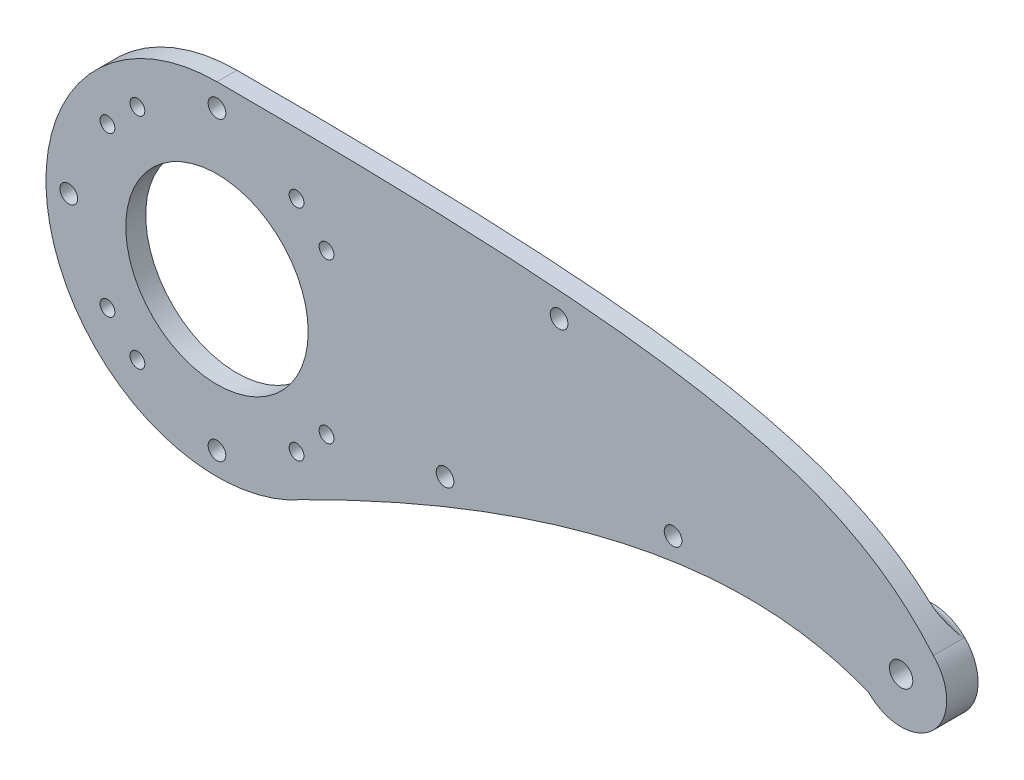
ISO-10303-21;
HEADER;
FILE_DESCRIPTION(('STEP AP214'),'2;1');
FILE_NAME('part.step','',(''),(''),'','','');
FILE_SCHEMA(('AUTOMOTIVE_DESIGN { 1 0 10303 214 1 1 1 1 }'));
ENDSEC;
DATA;
#1=APPLICATION_CONTEXT('core data for automotive mechanical design processes');
#2=APPLICATION_PROTOCOL_DEFINITION('international standard','automotive_design',2000,#1);
#3=PRODUCT_CONTEXT('',#1,'mechanical');
#4=PRODUCT('Part','Part','',(#3));
#5=PRODUCT_RELATED_PRODUCT_CATEGORY('part','',(#4));
#6=PRODUCT_DEFINITION_FORMATION('','',#4);
#7=PRODUCT_DEFINITION_CONTEXT('part definition',#1,'design');
#8=PRODUCT_DEFINITION('design','',#6,#7);
#9=PRODUCT_DEFINITION_SHAPE('','',#8);
#10=(LENGTH_UNIT() NAMED_UNIT(*) SI_UNIT(.MILLI.,.METRE.));
#11=(NAMED_UNIT(*) PLANE_ANGLE_UNIT() SI_UNIT($,.RADIAN.));
#12=(NAMED_UNIT(*) SI_UNIT($,.STERADIAN.) SOLID_ANGLE_UNIT());
#13=UNCERTAINTY_MEASURE_WITH_UNIT(LENGTH_MEASURE(1.E-05),#10,'distance_accuracy_value','');
#14=(GEOMETRIC_REPRESENTATION_CONTEXT(3) GLOBAL_UNCERTAINTY_ASSIGNED_CONTEXT((#13)) GLOBAL_UNIT_ASSIGNED_CONTEXT((#10,
#11,#12)) REPRESENTATION_CONTEXT('',''));
#15=CARTESIAN_POINT('',(0.,0.,0.));
#16=DIRECTION('',(0.,0.,1.));
#17=DIRECTION('',(1.,0.,0.));
#18=AXIS2_PLACEMENT_3D('',#15,#16,#17);
#19=CARTESIAN_POINT('',(86.7847382513976,24.9953267195614,0.));
#20=DIRECTION('',(0.,0.,1.));
#21=DIRECTION('',(1.,0.,0.));
#22=AXIS2_PLACEMENT_3D('',#19,#20,#21);
#23=PLANE('',#22);
#24=CARTESIAN_POINT('',(120.,0.,0.));
#25=DIRECTION('',(0.,0.,1.));
#26=DIRECTION('',(1.,0.,0.));
#27=AXIS2_PLACEMENT_3D('',#24,#25,#26);
#28=CIRCLE('',#27,2.04999999999999);
#29=CARTESIAN_POINT('',(122.05,0.,0.));
#30=VERTEX_POINT('',#29);
#31=EDGE_CURVE('E332',#30,#30,#28,.T.);
#32=ORIENTED_EDGE('',*,*,#31,.T.);
#33=EDGE_LOOP('',(#32));
#34=FACE_BOUND('',#33,.T.);
#35=CARTESIAN_POINT('',(120.,0.,0.));
#36=DIRECTION('',(0.,0.,-1.));
#37=DIRECTION('',(-1.,0.,0.));
#38=AXIS2_PLACEMENT_3D('',#35,#36,#37);
#39=CIRCLE('',#38,7.05);
#40=CARTESIAN_POINT('',(112.95,0.,0.));
#41=VERTEX_POINT('',#40);
#42=EDGE_CURVE('E335',#41,#41,#39,.T.);
#43=ORIENTED_EDGE('',*,*,#42,.T.);
#44=EDGE_LOOP('',(#43));
#45=FACE_BOUND('',#44,.T.);
#46=ADVANCED_FACE('F48',(#34,#45),#23,.F.);
#47=CARTESIAN_POINT('',(86.7847382513976,24.9953267195614,3.5));
#48=DIRECTION('',(0.,0.,1.));
#49=DIRECTION('',(1.,0.,0.));
#50=AXIS2_PLACEMENT_3D('',#47,#48,#49);
#51=PLANE('',#50);
#52=CARTESIAN_POINT('',(80.,1.,3.5));
#53=DIRECTION('',(0.,0.,1.));
#54=DIRECTION('',(1.,0.,0.));
#55=AXIS2_PLACEMENT_3D('',#52,#53,#54);
#56=CIRCLE('',#55,1.54999999999999);
#57=CARTESIAN_POINT('',(81.55,1.,3.5));
#58=VERTEX_POINT('',#57);
#59=EDGE_CURVE('E356',#58,#58,#56,.T.);
#60=ORIENTED_EDGE('',*,*,#59,.F.);
#61=EDGE_LOOP('',(#60));
#62=FACE_BOUND('',#61,.T.);
#63=CARTESIAN_POINT('',(0.,26.,3.5));
#64=DIRECTION('',(0.,0.,1.));
#65=DIRECTION('',(1.,0.,0.));
#66=AXIS2_PLACEMENT_3D('',#63,#64,#65);
#67=CIRCLE('',#66,1.55);
#68=CARTESIAN_POINT('',(1.55,26.,3.5));
#69=VERTEX_POINT('',#68);
#70=EDGE_CURVE('E372',#69,#69,#67,.T.);
#71=ORIENTED_EDGE('',*,*,#70,.F.);
#72=EDGE_LOOP('',(#71));
#73=FACE_BOUND('',#72,.T.);
#74=CARTESIAN_POINT('',(-19.2141536164048,13.9598997419465,3.5));
#75=DIRECTION('',(0.,0.,1.));
#76=DIRECTION('',(1.,0.,0.));
#77=AXIS2_PLACEMENT_3D('',#74,#75,#76);
#78=CIRCLE('',#77,1.3);
#79=CARTESIAN_POINT('',(-17.9141536164048,13.9598997419465,3.5));
#80=VERTEX_POINT('',#79);
#81=EDGE_CURVE('E384',#80,#80,#78,.T.);
#82=ORIENTED_EDGE('',*,*,#81,.F.);
#83=EDGE_LOOP('',(#82));
#84=FACE_BOUND('',#83,.T.);
#85=CARTESIAN_POINT('',(-13.9598997419464,-19.2141536164049,3.5));
#86=DIRECTION('',(0.,0.,1.));
#87=DIRECTION('',(1.,0.,0.));
#88=AXIS2_PLACEMENT_3D('',#85,#86,#87);
#89=CIRCLE('',#88,1.3);
#90=CARTESIAN_POINT('',(-12.6598997419464,-19.2141536164049,3.5));
#91=VERTEX_POINT('',#90);
#92=EDGE_CURVE('E395',#91,#91,#89,.T.);
#93=ORIENTED_EDGE('',*,*,#92,.F.);
#94=EDGE_LOOP('',(#93));
#95=FACE_BOUND('',#94,.T.);
#96=CARTESIAN_POINT('',(19.2141536164049,-13.9598997419463,3.5));
#97=DIRECTION('',(0.,0.,1.));
#98=DIRECTION('',(1.,0.,0.));
#99=AXIS2_PLACEMENT_3D('',#96,#97,#98);
#100=CIRCLE('',#99,1.3);
#101=CARTESIAN_POINT('',(20.5141536164049,-13.9598997419463,3.5));
#102=VERTEX_POINT('',#101);
#103=EDGE_CURVE('E403',#102,#102,#100,.T.);
#104=ORIENTED_EDGE('',*,*,#103,.F.);
#105=EDGE_LOOP('',(#104));
#106=FACE_BOUND('',#105,.T.);
#107=CARTESIAN_POINT('',(-26.,0.,3.5));
#108=DIRECTION('',(0.,0.,1.));
#109=DIRECTION('',(1.,0.,0.));
#110=AXIS2_PLACEMENT_3D('',#107,#108,#109);
#111=CIRCLE('',#110,1.55);
#112=CARTESIAN_POINT('',(-24.45,0.,3.5));
#113=VERTEX_POINT('',#112);
#114=EDGE_CURVE('E412',#113,#113,#111,.T.);
#115=ORIENTED_EDGE('',*,*,#114,.F.);
#116=EDGE_LOOP('',(#115));
#117=FACE_BOUND('',#116,.T.);
#118=CARTESIAN_POINT('',(0.,0.,3.5));
#119=DIRECTION('',(0.,0.,1.));
#120=DIRECTION('',(1.,0.,0.));
#121=AXIS2_PLACEMENT_3D('',#118,#119,#120);
#122=CIRCLE('',#121,16.);
#123=CARTESIAN_POINT('',(16.,0.,3.5));
#124=VERTEX_POINT('',#123);
#125=EDGE_CURVE('E426',#124,#124,#122,.T.);
#126=ORIENTED_EDGE('',*,*,#125,.F.);
#127=EDGE_LOOP('',(#126));
#128=FACE_BOUND('',#127,.T.);
#129=CARTESIAN_POINT('',(19.2141536164051,13.9598997419461,3.5));
#130=DIRECTION('',(0.,0.,1.));
#131=DIRECTION('',(1.,0.,0.));
#132=AXIS2_PLACEMENT_3D('',#129,#130,#131);
#133=CIRCLE('',#132,1.3);
#134=CARTESIAN_POINT('',(20.5141536164051,13.9598997419461,3.5));
#135=VERTEX_POINT('',#134);
#136=EDGE_CURVE('E217',#135,#135,#133,.T.);
#137=ORIENTED_EDGE('',*,*,#136,.F.);
#138=EDGE_LOOP('',(#137));
#139=FACE_BOUND('',#138,.T.);
#140=CARTESIAN_POINT('',(125.656854249492,5.6568542494924,3.5));
#141=CARTESIAN_POINT('',(109.540350587229,24.7685865023329,3.5));
#142=CARTESIAN_POINT('',(80.,30.,3.5));
#143=CARTESIAN_POINT('',(0.,30.,3.5));
#144=B_SPLINE_CURVE_WITH_KNOTS('',3,(#140,#141,#142,#143),.UNSPECIFIED.,.F.,.F.,(4,4),(0.,1.),.UNSPECIFIED.);
#145=CARTESIAN_POINT('',(125.656854249492,5.65685424949239,3.5));
#146=VERTEX_POINT('',#145);
#147=CARTESIAN_POINT('',(0.,30.,3.5));
#148=VERTEX_POINT('',#147);
#149=EDGE_CURVE('E113',#146,#148,#144,.T.);
#150=ORIENTED_EDGE('',*,*,#149,.T.);
#151=CARTESIAN_POINT('',(0.,0.,3.5));
#152=DIRECTION('',(0.,0.,1.));
#153=DIRECTION('',(1.,0.,0.));
#154=AXIS2_PLACEMENT_3D('',#151,#152,#153);
#155=CIRCLE('',#154,30.);
#156=CARTESIAN_POINT('',(15.0000000000001,-25.9807621135331,3.5));
#157=VERTEX_POINT('',#156);
#158=EDGE_CURVE('E102',#148,#157,#155,.T.);
#159=ORIENTED_EDGE('',*,*,#158,.T.);
#160=CARTESIAN_POINT('',(15.0000000000001,-25.9807621135331,3.5));
#161=CARTESIAN_POINT('',(82.0010347276407,7.72178000758147,3.5));
#162=CARTESIAN_POINT('',(114.343145750508,-5.65685424949239,3.5));
#163=B_SPLINE_CURVE_WITH_KNOTS('',2,(#160,#161,#162),.UNSPECIFIED.,.F.,.F.,(3,3),(0.,1.),.UNSPECIFIED.);
#164=CARTESIAN_POINT('',(114.343145750508,-5.65685424949239,3.5));
#165=VERTEX_POINT('',#164);
#166=EDGE_CURVE('E112',#157,#165,#163,.T.);
#167=ORIENTED_EDGE('',*,*,#166,.T.);
#168=CARTESIAN_POINT('',(120.,0.,3.5));
#169=DIRECTION('',(0.,0.,1.));
#170=DIRECTION('',(-1.,0.,0.));
#171=AXIS2_PLACEMENT_3D('',#168,#169,#170);
#172=CIRCLE('',#171,8.);
#173=EDGE_CURVE('E119',#165,#146,#172,.T.);
#174=ORIENTED_EDGE('',*,*,#173,.T.);
#175=EDGE_LOOP('',(#150,#159,#167,#174));
#176=FACE_BOUND('',#175,.T.);
#177=CARTESIAN_POINT('',(13.9598997419463,19.214153616405,3.5));
#178=DIRECTION('',(0.,0.,1.));
#179=DIRECTION('',(1.,0.,0.));
#180=AXIS2_PLACEMENT_3D('',#177,#178,#179);
#181=CIRCLE('',#180,1.3);
#182=CARTESIAN_POINT('',(15.2598997419463,19.214153616405,3.5));
#183=VERTEX_POINT('',#182);
#184=EDGE_CURVE('E430',#183,#183,#181,.T.);
#185=ORIENTED_EDGE('',*,*,#184,.F.);
#186=EDGE_LOOP('',(#185));
#187=FACE_BOUND('',#186,.T.);
#188=CARTESIAN_POINT('',(120.,0.,3.5));
#189=DIRECTION('',(0.,0.,1.));
#190=DIRECTION('',(1.,0.,0.));
#191=AXIS2_PLACEMENT_3D('',#188,#189,#190);
#192=CIRCLE('',#191,2.04999999999999);
#193=CARTESIAN_POINT('',(122.05,0.,3.5));
#194=VERTEX_POINT('',#193);
#195=EDGE_CURVE('E419',#194,#194,#192,.T.);
#196=ORIENTED_EDGE('',*,*,#195,.F.);
#197=EDGE_LOOP('',(#196));
#198=FACE_BOUND('',#197,.T.);
#199=CARTESIAN_POINT('',(13.9598997419461,-19.2141536164051,3.5));
#200=DIRECTION('',(0.,0.,1.));
#201=DIRECTION('',(1.,0.,0.));
#202=AXIS2_PLACEMENT_3D('',#199,#200,#201);
#203=CIRCLE('',#202,1.3);
#204=CARTESIAN_POINT('',(15.2598997419461,-19.2141536164051,3.5));
#205=VERTEX_POINT('',#204);
#206=EDGE_CURVE('E407',#205,#205,#203,.T.);
#207=ORIENTED_EDGE('',*,*,#206,.F.);
#208=EDGE_LOOP('',(#207));
#209=FACE_BOUND('',#208,.T.);
#210=CARTESIAN_POINT('',(-19.2141536164052,-13.959899741946,3.5));
#211=DIRECTION('',(0.,0.,1.));
#212=DIRECTION('',(1.,0.,0.));
#213=AXIS2_PLACEMENT_3D('',#210,#211,#212);
#214=CIRCLE('',#213,1.3);
#215=CARTESIAN_POINT('',(-17.9141536164052,-13.959899741946,3.5));
#216=VERTEX_POINT('',#215);
#217=EDGE_CURVE('E399',#216,#216,#214,.T.);
#218=ORIENTED_EDGE('',*,*,#217,.F.);
#219=EDGE_LOOP('',(#218));
#220=FACE_BOUND('',#219,.T.);
#221=CARTESIAN_POINT('',(-13.9598997419459,19.2141536164052,3.5));
#222=DIRECTION('',(0.,0.,1.));
#223=DIRECTION('',(1.,0.,0.));
#224=AXIS2_PLACEMENT_3D('',#221,#222,#223);
#225=CIRCLE('',#224,1.3);
#226=CARTESIAN_POINT('',(-12.6598997419459,19.2141536164052,3.5));
#227=VERTEX_POINT('',#226);
#228=EDGE_CURVE('E391',#227,#227,#225,.T.);
#229=ORIENTED_EDGE('',*,*,#228,.F.);
#230=EDGE_LOOP('',(#229));
#231=FACE_BOUND('',#230,.T.);
#232=CARTESIAN_POINT('',(40.,-10.,3.5));
#233=DIRECTION('',(0.,0.,1.));
#234=DIRECTION('',(1.,0.,0.));
#235=AXIS2_PLACEMENT_3D('',#232,#233,#234);
#236=CIRCLE('',#235,1.55);
#237=CARTESIAN_POINT('',(41.55,-10.,3.5));
#238=VERTEX_POINT('',#237);
#239=EDGE_CURVE('E380',#238,#238,#236,.T.);
#240=ORIENTED_EDGE('',*,*,#239,.F.);
#241=EDGE_LOOP('',(#240));
#242=FACE_BOUND('',#241,.T.);
#243=CARTESIAN_POINT('',(-2.72620909703935E-13,-26.,3.5));
#244=DIRECTION('',(0.,0.,1.));
#245=DIRECTION('',(1.,0.,0.));
#246=AXIS2_PLACEMENT_3D('',#243,#244,#245);
#247=CIRCLE('',#246,1.55);
#248=CARTESIAN_POINT('',(1.54999999999972,-26.,3.5));
#249=VERTEX_POINT('',#248);
#250=EDGE_CURVE('E364',#249,#249,#247,.T.);
#251=ORIENTED_EDGE('',*,*,#250,.F.);
#252=EDGE_LOOP('',(#251));
#253=FACE_BOUND('',#252,.T.);
#254=CARTESIAN_POINT('',(60.,24.,3.5));
#255=DIRECTION('',(0.,0.,1.));
#256=DIRECTION('',(1.,0.,0.));
#257=AXIS2_PLACEMENT_3D('',#254,#255,#256);
#258=CIRCLE('',#257,1.54999999999999);
#259=CARTESIAN_POINT('',(61.55,24.,3.5));
#260=VERTEX_POINT('',#259);
#261=EDGE_CURVE('E348',#260,#260,#258,.T.);
#262=ORIENTED_EDGE('',*,*,#261,.F.);
#263=EDGE_LOOP('',(#262));
#264=FACE_BOUND('',#263,.T.);
#265=ADVANCED_FACE('F116',(#62,#73,#84,#95,#106,#117,#128,#139,#176,#187,#198,#209,#220,#231,
#242,#253,#264),#51,.T.);
#266=CARTESIAN_POINT('',(-13.9598997419459,19.2141536164052,0.));
#267=DIRECTION('',(0.,0.,1.));
#268=DIRECTION('',(1.,0.,0.));
#269=AXIS2_PLACEMENT_3D('',#266,#267,#268);
#270=CIRCLE('',#269,2.39999999999997);
#271=CARTESIAN_POINT('',(-11.559899741946,19.2141536164052,0.));
#272=VERTEX_POINT('',#271);
#273=EDGE_CURVE('E162',#272,#272,#270,.T.);
#274=ORIENTED_EDGE('',*,*,#273,.T.);
#275=EDGE_LOOP('',(#274));
#276=FACE_BOUND('',#275,.T.);
#277=CARTESIAN_POINT('',(-19.2141536164048,13.9598997419465,0.));
#278=DIRECTION('',(0.,0.,1.));
#279=DIRECTION('',(1.,0.,0.));
#280=AXIS2_PLACEMENT_3D('',#277,#278,#279);
#281=CIRCLE('',#280,2.40000000000001);
#282=CARTESIAN_POINT('',(-16.8141536164048,13.9598997419465,0.));
#283=VERTEX_POINT('',#282);
#284=EDGE_CURVE('E158',#283,#283,#281,.T.);
#285=ORIENTED_EDGE('',*,*,#284,.T.);
#286=EDGE_LOOP('',(#285));
#287=FACE_BOUND('',#286,.T.);
#288=CARTESIAN_POINT('',(-19.2141536164052,-13.959899741946,0.));
#289=DIRECTION('',(0.,0.,1.));
#290=DIRECTION('',(1.,0.,0.));
#291=AXIS2_PLACEMENT_3D('',#288,#289,#290);
#292=CIRCLE('',#291,2.39999999999997);
#293=CARTESIAN_POINT('',(-16.8141536164052,-13.959899741946,0.));
#294=VERTEX_POINT('',#293);
#295=EDGE_CURVE('E154',#294,#294,#292,.T.);
#296=ORIENTED_EDGE('',*,*,#295,.T.);
#297=EDGE_LOOP('',(#296));
#298=FACE_BOUND('',#297,.T.);
#299=CARTESIAN_POINT('',(-13.9598997419464,-19.2141536164049,0.));
#300=DIRECTION('',(0.,0.,1.));
#301=DIRECTION('',(1.,0.,0.));
#302=AXIS2_PLACEMENT_3D('',#299,#300,#301);
#303=CIRCLE('',#302,2.39999999999997);
#304=CARTESIAN_POINT('',(-11.5598997419464,-19.2141536164049,0.));
#305=VERTEX_POINT('',#304);
#306=EDGE_CURVE('E150',#305,#305,#303,.T.);
#307=ORIENTED_EDGE('',*,*,#306,.T.);
#308=EDGE_LOOP('',(#307));
#309=FACE_BOUND('',#308,.T.);
#310=CARTESIAN_POINT('',(13.9598997419461,-19.2141536164051,0.));
#311=DIRECTION('',(0.,0.,1.));
#312=DIRECTION('',(1.,0.,0.));
#313=AXIS2_PLACEMENT_3D('',#310,#311,#312);
#314=CIRCLE('',#313,2.39999999999997);
#315=CARTESIAN_POINT('',(16.359899741946,-19.2141536164051,0.));
#316=VERTEX_POINT('',#315);
#317=EDGE_CURVE('E146',#316,#316,#314,.T.);
#318=ORIENTED_EDGE('',*,*,#317,.T.);
#319=EDGE_LOOP('',(#318));
#320=FACE_BOUND('',#319,.T.);
#321=CARTESIAN_POINT('',(19.2141536164049,-13.9598997419463,0.));
#322=DIRECTION('',(0.,0.,1.));
#323=DIRECTION('',(1.,0.,0.));
#324=AXIS2_PLACEMENT_3D('',#321,#322,#323);
#325=CIRCLE('',#324,2.39999999999997);
#326=CARTESIAN_POINT('',(21.6141536164049,-13.9598997419463,0.));
#327=VERTEX_POINT('',#326);
#328=EDGE_CURVE('E142',#327,#327,#325,.T.);
#329=ORIENTED_EDGE('',*,*,#328,.T.);
#330=EDGE_LOOP('',(#329));
#331=FACE_BOUND('',#330,.T.);
#332=CARTESIAN_POINT('',(19.2141536164051,13.9598997419461,0.));
#333=DIRECTION('',(0.,0.,1.));
#334=DIRECTION('',(1.,0.,0.));
#335=AXIS2_PLACEMENT_3D('',#332,#333,#334);
#336=CIRCLE('',#335,2.39999999999997);
#337=CARTESIAN_POINT('',(21.6141536164051,13.9598997419461,0.));
#338=VERTEX_POINT('',#337);
#339=EDGE_CURVE('E133',#338,#338,#336,.T.);
#340=ORIENTED_EDGE('',*,*,#339,.T.);
#341=EDGE_LOOP('',(#340));
#342=FACE_BOUND('',#341,.T.);
#343=CARTESIAN_POINT('',(13.9598997419463,19.214153616405,0.));
#344=DIRECTION('',(0.,0.,1.));
#345=DIRECTION('',(1.,0.,0.));
#346=AXIS2_PLACEMENT_3D('',#343,#344,#345);
#347=CIRCLE('',#346,2.39999999999997);
#348=CARTESIAN_POINT('',(16.3598997419462,19.214153616405,0.));
#349=VERTEX_POINT('',#348);
#350=EDGE_CURVE('E128',#349,#349,#347,.T.);
#351=ORIENTED_EDGE('',*,*,#350,.T.);
#352=EDGE_LOOP('',(#351));
#353=FACE_BOUND('',#352,.T.);
#354=CARTESIAN_POINT('',(125.656854249492,5.6568542494924,0.));
#355=CARTESIAN_POINT('',(109.540350587229,24.7685865023329,0.));
#356=CARTESIAN_POINT('',(80.,30.,0.));
#357=CARTESIAN_POINT('',(0.,30.,0.));
#358=B_SPLINE_CURVE_WITH_KNOTS('',3,(#354,#355,#356,#357),.UNSPECIFIED.,.F.,.F.,(4,4),(0.,1.),.UNSPECIFIED.);
#359=CARTESIAN_POINT('',(121.63931092164,9.86471792309337,0.));
#360=VERTEX_POINT('',#359);
#361=CARTESIAN_POINT('',(0.,30.,0.));
#362=VERTEX_POINT('',#361);
#363=EDGE_CURVE('E125',#360,#362,#358,.T.);
#364=ORIENTED_EDGE('',*,*,#363,.F.);
#365=CARTESIAN_POINT('',(120.,0.,0.));
#366=DIRECTION('',(0.,0.,1.));
#367=DIRECTION('',(1.,0.,0.));
#368=AXIS2_PLACEMENT_3D('',#365,#366,#367);
#369=CIRCLE('',#368,10.);
#370=CARTESIAN_POINT('',(111.041115038127,-4.44278969116536,0.));
#371=VERTEX_POINT('',#370);
#372=EDGE_CURVE('E76',#360,#371,#369,.T.);
#373=ORIENTED_EDGE('',*,*,#372,.T.);
#374=CARTESIAN_POINT('',(15.0000000000001,-25.9807621135331,0.));
#375=CARTESIAN_POINT('',(82.0010347276407,7.72178000758147,0.));
#376=CARTESIAN_POINT('',(114.343145750508,-5.65685424949239,0.));
#377=B_SPLINE_CURVE_WITH_KNOTS('',2,(#374,#375,#376),.UNSPECIFIED.,.F.,.F.,(3,3),(0.,1.),.UNSPECIFIED.);
#378=CARTESIAN_POINT('',(15.0000000000001,-25.9807621135331,0.));
#379=VERTEX_POINT('',#378);
#380=EDGE_CURVE('E122',#379,#371,#377,.T.);
#381=ORIENTED_EDGE('',*,*,#380,.F.);
#382=CARTESIAN_POINT('',(0.,0.,0.));
#383=DIRECTION('',(0.,0.,1.));
#384=DIRECTION('',(1.,0.,0.));
#385=AXIS2_PLACEMENT_3D('',#382,#383,#384);
#386=CIRCLE('',#385,30.);
#387=EDGE_CURVE('E442',#362,#379,#386,.T.);
#388=ORIENTED_EDGE('',*,*,#387,.F.);
#389=EDGE_LOOP('',(#364,#373,#381,#388));
#390=FACE_BOUND('',#389,.T.);
#391=CARTESIAN_POINT('',(0.,0.,0.));
#392=DIRECTION('',(0.,0.,1.));
#393=DIRECTION('',(1.,0.,0.));
#394=AXIS2_PLACEMENT_3D('',#391,#392,#393);
#395=CIRCLE('',#394,16.);
#396=CARTESIAN_POINT('',(16.,0.,0.));
#397=VERTEX_POINT('',#396);
#398=EDGE_CURVE('E423',#397,#397,#395,.T.);
#399=ORIENTED_EDGE('',*,*,#398,.T.);
#400=EDGE_LOOP('',(#399));
#401=FACE_BOUND('',#400,.T.);
#402=CARTESIAN_POINT('',(-26.,0.,0.));
#403=DIRECTION('',(0.,0.,1.));
#404=DIRECTION('',(1.,0.,0.));
#405=AXIS2_PLACEMENT_3D('',#402,#403,#404);
#406=CIRCLE('',#405,1.55);
#407=CARTESIAN_POINT('',(-24.45,0.,0.));
#408=VERTEX_POINT('',#407);
#409=EDGE_CURVE('E411',#408,#408,#406,.T.);
#410=ORIENTED_EDGE('',*,*,#409,.T.);
#411=EDGE_LOOP('',(#410));
#412=FACE_BOUND('',#411,.T.);
#413=CARTESIAN_POINT('',(40.,-10.,0.));
#414=DIRECTION('',(0.,0.,1.));
#415=DIRECTION('',(1.,0.,0.));
#416=AXIS2_PLACEMENT_3D('',#413,#414,#415);
#417=CIRCLE('',#416,1.55);
#418=CARTESIAN_POINT('',(41.55,-10.,0.));
#419=VERTEX_POINT('',#418);
#420=EDGE_CURVE('E376',#419,#419,#417,.T.);
#421=ORIENTED_EDGE('',*,*,#420,.T.);
#422=EDGE_LOOP('',(#421));
#423=FACE_BOUND('',#422,.T.);
#424=CARTESIAN_POINT('',(0.,26.,0.));
#425=DIRECTION('',(0.,0.,1.));
#426=DIRECTION('',(1.,0.,0.));
#427=AXIS2_PLACEMENT_3D('',#424,#425,#426);
#428=CIRCLE('',#427,1.55);
#429=CARTESIAN_POINT('',(1.55,26.,0.));
#430=VERTEX_POINT('',#429);
#431=EDGE_CURVE('E368',#430,#430,#428,.T.);
#432=ORIENTED_EDGE('',*,*,#431,.T.);
#433=EDGE_LOOP('',(#432));
#434=FACE_BOUND('',#433,.T.);
#435=CARTESIAN_POINT('',(-2.72620909703935E-13,-26.,0.));
#436=DIRECTION('',(0.,0.,1.));
#437=DIRECTION('',(1.,0.,0.));
#438=AXIS2_PLACEMENT_3D('',#435,#436,#437);
#439=CIRCLE('',#438,1.55);
#440=CARTESIAN_POINT('',(1.54999999999972,-26.,0.));
#441=VERTEX_POINT('',#440);
#442=EDGE_CURVE('E360',#441,#441,#439,.T.);
#443=ORIENTED_EDGE('',*,*,#442,.T.);
#444=EDGE_LOOP('',(#443));
#445=FACE_BOUND('',#444,.T.);
#446=CARTESIAN_POINT('',(80.,1.,0.));
#447=DIRECTION('',(0.,0.,1.));
#448=DIRECTION('',(1.,0.,0.));
#449=AXIS2_PLACEMENT_3D('',#446,#447,#448);
#450=CIRCLE('',#449,1.54999999999999);
#451=CARTESIAN_POINT('',(81.55,1.,0.));
#452=VERTEX_POINT('',#451);
#453=EDGE_CURVE('E352',#452,#452,#450,.T.);
#454=ORIENTED_EDGE('',*,*,#453,.T.);
#455=EDGE_LOOP('',(#454));
#456=FACE_BOUND('',#455,.T.);
#457=CARTESIAN_POINT('',(60.,24.,0.));
#458=DIRECTION('',(0.,0.,1.));
#459=DIRECTION('',(1.,0.,0.));
#460=AXIS2_PLACEMENT_3D('',#457,#458,#459);
#461=CIRCLE('',#460,1.54999999999999);
#462=CARTESIAN_POINT('',(61.55,24.,0.));
#463=VERTEX_POINT('',#462);
#464=EDGE_CURVE('E347',#463,#463,#461,.T.);
#465=ORIENTED_EDGE('',*,*,#464,.T.);
#466=EDGE_LOOP('',(#465));
#467=FACE_BOUND('',#466,.T.);
#468=ADVANCED_FACE('F209',(#276,#287,#298,#309,#320,#331,#342,#353,#390,#401,#412,#423,#434,
#445,#456,#467),#23,.F.);
#469=DIRECTION('',(0.,0.,-1.));
#470=VECTOR('',#469,1.);
#471=SURFACE_OF_LINEAR_EXTRUSION('',#144,#470);
#472=DIRECTION('',(0.,0.,-1.));
#473=VECTOR('',#472,1.);
#474=CARTESIAN_POINT('',(125.656854249492,5.65685424949239,3.5));
#475=LINE('',#474,#473);
#476=CARTESIAN_POINT('',(125.656854249492,5.6568542494924,-2.));
#477=VERTEX_POINT('',#476);
#478=EDGE_CURVE('E455',#146,#477,#475,.T.);
#479=ORIENTED_EDGE('',*,*,#478,.T.);
#480=CARTESIAN_POINT('',(125.656854249492,5.65685424949239,-2.));
#481=CARTESIAN_POINT('',(125.656878115282,5.65682580531276,-1.98923410726098));
#482=CARTESIAN_POINT('',(125.656193474849,5.65763783932299,-1.97852351594008));
#483=CARTESIAN_POINT('',(125.653643639893,5.66066124785027,-1.95762297460612));
#484=CARTESIAN_POINT('',(125.651798365397,5.66284901051548,-1.94742731508883));
#485=CARTESIAN_POINT('',(125.64622457658,5.66945548850548,-1.9236425159121));
#486=CARTESIAN_POINT('',(125.642038762416,5.6744156544355,-1.91031859446455));
#487=CARTESIAN_POINT('',(125.632404036874,5.68582655178894,-1.88472688017274));
#488=CARTESIAN_POINT('',(125.626945013023,5.69228921542494,-1.87246868248156));
#489=CARTESIAN_POINT('',(125.612932162396,5.70886801676158,-1.84433678329303));
#490=CARTESIAN_POINT('',(125.604002033177,5.7194256169814,-1.82891931098171));
#491=CARTESIAN_POINT('',(125.585230286049,5.74159699650727,-1.79944160111991));
#492=CARTESIAN_POINT('',(125.575386568963,5.75321320704975,-1.78538464889695));
#493=CARTESIAN_POINT('',(125.555077278853,5.77715518461419,-1.75821403646903));
#494=CARTESIAN_POINT('',(125.544608859105,5.78948419035003,-1.74510541009353));
#495=CARTESIAN_POINT('',(125.523293726128,5.81456132248158,-1.71966785450036));
#496=CARTESIAN_POINT('',(125.512447476025,5.82730893474247,-1.70733801947494));
#497=CARTESIAN_POINT('',(125.485066694236,5.85945493462641,-1.67733413976901));
#498=CARTESIAN_POINT('',(125.468360141359,5.87903843371214,-1.66001688741376));
#499=CARTESIAN_POINT('',(125.434527734174,5.91863137128925,-1.62629909032899));
#500=CARTESIAN_POINT('',(125.417401763052,5.93864092823663,-1.60989880526137));
#501=CARTESIAN_POINT('',(125.365513798631,5.99916347815258,-1.56165779338187));
#502=CARTESIAN_POINT('',(125.330300616622,6.04010121669234,-1.53083839001694));
#503=CARTESIAN_POINT('',(125.259102356201,6.12258773484445,-1.47086929222873));
#504=CARTESIAN_POINT('',(125.223116602265,6.16413703831512,-1.44172114826897));
#505=CARTESIAN_POINT('',(125.150594031099,6.24757866341458,-1.38465275705702));
#506=CARTESIAN_POINT('',(125.114057311592,6.28947092362565,-1.35673229541683));
#507=CARTESIAN_POINT('',(125.040573604578,6.37342774498093,-1.30187947880885));
#508=CARTESIAN_POINT('',(125.003627168391,6.41549203553728,-1.27494596652413));
#509=CARTESIAN_POINT('',(124.929348740515,6.49975820570841,-1.22189668800807));
#510=CARTESIAN_POINT('',(124.892016905994,6.54196002477947,-1.19578060468167));
#511=CARTESIAN_POINT('',(124.761775305452,6.68866282893765,-1.10634612259247));
#512=CARTESIAN_POINT('',(124.66792920956,6.79344378857368,-1.04484240519064));
#513=CARTESIAN_POINT('',(124.478188512267,7.00337674177722,-0.925726586848504));
#514=CARTESIAN_POINT('',(124.382293690753,7.10852877418903,-0.868114906861907));
#515=CARTESIAN_POINT('',(124.188371109224,7.3192181630363,-0.756855467583681));
#516=CARTESIAN_POINT('',(124.090341119344,7.42475581606753,-0.703212137605925));
#517=CARTESIAN_POINT('',(123.892230240143,7.63604701781556,-0.600316648235678));
#518=CARTESIAN_POINT('',(123.792149275613,7.74180057432105,-0.551064650228908));
#519=CARTESIAN_POINT('',(123.489858361181,8.0581957153238,-0.411118702297774));
#520=CARTESIAN_POINT('',(123.284536113308,8.26912963518556,-0.32761422940204));
#521=CARTESIAN_POINT('',(122.865825408799,8.69091950870805,-0.185050377429904));
#522=CARTESIAN_POINT('',(122.652448417752,8.90177517156809,-0.125957582481993));
#523=CARTESIAN_POINT('',(122.30528947049,9.23801995911977,-0.0562846185477124));
#524=CARTESIAN_POINT('',(122.173886232127,9.36378898495064,-0.0357532511405675));
#525=CARTESIAN_POINT('',(121.97487730371,9.55197766969433,-0.0146456411657375));
#526=CARTESIAN_POINT('',(121.908102537921,9.61474156197623,-0.00922370846249331));
#527=CARTESIAN_POINT('',(121.774055819397,9.73997459239974,-0.00190262273112516));
#528=CARTESIAN_POINT('',(121.706783745621,9.80244365228412,-4.35771664724811E-06));
#529=CARTESIAN_POINT('',(121.63931092164,9.86471792309296,0.));
#530=B_SPLINE_CURVE_WITH_KNOTS('',3,(#480,#481,#482,#483,#484,#485,#486,#487,#488,#489,#490,
#491,#492,#493,#494,#495,#496,#497,#498,#499,#500,#501,#502,#503,#504,#505,#506,#507,#508,#509,
#510,#511,#512,#513,#514,#515,#516,#517,#518,#519,#520,#521,#522,#523,#524,#525,#526,#527,#528,
#529),.UNSPECIFIED.,.F.,.F.,(4,2,2,2,2,2,2,2,2,2,2,2,2,2,2,2,2,2,2,2,2,2,2,2,4),(0.,
0.0321568608483,0.0637763324790049,0.107985642003391,0.152558820032273,0.214529051187129,
0.276645375396055,0.33907032876466,0.40142128571004,0.494463000141112,0.587530929559352,
0.773995288939261,0.960629925838487,1.14723184056375,1.33360744268204,1.51990982709913,
1.98039568907798,2.44093127666077,2.90197337356638,3.36303240723965,4.28008832924801,
5.19588474816872,5.74459600239194,6.01993805656143,6.29534949137204),.UNSPECIFIED.);
#531=EDGE_CURVE('E63',#477,#360,#530,.T.);
#532=ORIENTED_EDGE('',*,*,#531,.T.);
#533=ORIENTED_EDGE('',*,*,#363,.T.);
#534=DIRECTION('',(0.,0.,-1.));
#535=VECTOR('',#534,1.);
#536=CARTESIAN_POINT('',(0.,30.,3.5));
#537=LINE('',#536,#535);
#538=EDGE_CURVE('E106',#148,#362,#537,.T.);
#539=ORIENTED_EDGE('',*,*,#538,.F.);
#540=ORIENTED_EDGE('',*,*,#149,.F.);
#541=EDGE_LOOP('',(#479,#532,#533,#539,#540));
#542=FACE_BOUND('',#541,.T.);
#543=ADVANCED_FACE('F124',(#542),#471,.F.);
#544=CARTESIAN_POINT('',(0.,0.,3.5));
#545=DIRECTION('',(0.,0.,-1.));
#546=DIRECTION('',(-1.,0.,0.));
#547=AXIS2_PLACEMENT_3D('',#544,#545,#546);
#548=CYLINDRICAL_SURFACE('',#547,30.);
#549=ORIENTED_EDGE('',*,*,#387,.T.);
#550=DIRECTION('',(0.,0.,-1.));
#551=VECTOR('',#550,1.);
#552=CARTESIAN_POINT('',(15.0000000000001,-25.9807621135331,3.5));
#553=LINE('',#552,#551);
#554=EDGE_CURVE('E108',#157,#379,#553,.T.);
#555=ORIENTED_EDGE('',*,*,#554,.F.);
#556=ORIENTED_EDGE('',*,*,#158,.F.);
#557=ORIENTED_EDGE('',*,*,#538,.T.);
#558=EDGE_LOOP('',(#549,#555,#556,#557));
#559=FACE_BOUND('',#558,.T.);
#560=ADVANCED_FACE('F104',(#559),#548,.T.);
#561=DIRECTION('',(0.,0.,-1.));
#562=VECTOR('',#561,1.);
#563=SURFACE_OF_LINEAR_EXTRUSION('',#163,#562);
#564=ORIENTED_EDGE('',*,*,#380,.T.);
#565=CARTESIAN_POINT('',(111.041115038127,-4.44278969116546,0.));
#566=CARTESIAN_POINT('',(111.119025201588,-4.4680323901237,-4.71824660751099E-06));
#567=CARTESIAN_POINT('',(111.196849106685,-4.49347792385971,-0.00257375985150599));
#568=CARTESIAN_POINT('',(111.351989135807,-4.54465986599618,-0.012526683294555));
#569=CARTESIAN_POINT('',(111.429305765469,-4.57039587945593,-0.0199046571609134));
#570=CARTESIAN_POINT('',(111.583267602888,-4.62209937607141,-0.0391605858675427));
#571=CARTESIAN_POINT('',(111.659912984955,-4.64806679537493,-0.0510373347364573));
#572=CARTESIAN_POINT('',(111.813097009431,-4.70041737425033,-0.0791566695119421));
#573=CARTESIAN_POINT('',(111.889627594616,-4.72680213339591,-0.0954399912345546));
#574=CARTESIAN_POINT('',(112.041692443393,-4.77967985037988,-0.132083020336099));
#575=CARTESIAN_POINT('',(112.117226411809,-4.80617283735969,-0.152443907743193));
#576=CARTESIAN_POINT('',(112.267126129799,-4.8591919918007,-0.197037618435284));
#577=CARTESIAN_POINT('',(112.341491850704,-4.88571816005901,-0.22127053658236));
#578=CARTESIAN_POINT('',(112.529964747987,-4.95349970978222,-0.287975303592991));
#579=CARTESIAN_POINT('',(112.643154084649,-4.99473575577347,-0.333091665712675));
#580=CARTESIAN_POINT('',(112.865813673112,-5.07684878033187,-0.43198116101769));
#581=CARTESIAN_POINT('',(112.975283682008,-5.11772573531849,-0.485754858290957));
#582=CARTESIAN_POINT('',(113.189259704323,-5.19856031342697,-0.601762243480733));
#583=CARTESIAN_POINT('',(113.293788023784,-5.23852154059745,-0.663951767935079));
#584=CARTESIAN_POINT('',(113.446272703316,-5.29745287476612,-0.764232588297865));
#585=CARTESIAN_POINT('',(113.496363596869,-5.31692057453372,-0.798810238246049));
#586=CARTESIAN_POINT('',(113.594874761012,-5.35540896194651,-0.87050019501089));
#587=CARTESIAN_POINT('',(113.643295232776,-5.37442970333169,-0.907612194992594));
#588=CARTESIAN_POINT('',(113.752295102934,-5.41746411717335,-0.996143927840663));
#589=CARTESIAN_POINT('',(113.812183061422,-5.44127091683614,-1.04852470515416));
#590=CARTESIAN_POINT('',(113.927571419511,-5.4874178717521,-1.15908091017432));
#591=CARTESIAN_POINT('',(113.983054207086,-5.50975208463256,-1.21727768418828));
#592=CARTESIAN_POINT('',(114.061460511499,-5.54148150413915,-1.31022695457291));
#593=CARTESIAN_POINT('',(114.086982673063,-5.5518404407423,-1.34244184438593));
#594=CARTESIAN_POINT('',(114.135718207834,-5.57167057395116,-1.40881476498103));
#595=CARTESIAN_POINT('',(114.158930837573,-5.58114148463307,-1.44297341595952));
#596=CARTESIAN_POINT('',(114.223747540502,-5.60764618102039,-1.54803313457609));
#597=CARTESIAN_POINT('',(114.26118721426,-5.62303849340125,-1.62225313807965));
#598=CARTESIAN_POINT('',(114.297682807659,-5.63807725107076,-1.72397813829762));
#599=CARTESIAN_POINT('',(114.305301974272,-5.64122013901132,-1.74797976660348));
#600=CARTESIAN_POINT('',(114.318595460627,-5.64670699541615,-1.7966012320001));
#601=CARTESIAN_POINT('',(114.324270881762,-5.64905141631466,-1.8212207104791));
#602=CARTESIAN_POINT('',(114.333558683412,-5.65288946500869,-1.8713713408181));
#603=CARTESIAN_POINT('',(114.337132578442,-5.65436722024971,-1.89691091948119));
#604=CARTESIAN_POINT('',(114.341936799056,-5.65635415881265,-1.94829606369582));
#605=CARTESIAN_POINT('',(114.343162476094,-5.65686142093767,-1.97414213447789));
#606=CARTESIAN_POINT('',(114.343145750508,-5.65685424949239,-1.99999999999999));
#607=B_SPLINE_CURVE_WITH_KNOTS('',3,(#565,#566,#567,#568,#569,#570,#571,#572,#573,#574,#575,
#576,#577,#578,#579,#580,#581,#582,#583,#584,#585,#586,#587,#588,#589,#590,#591,#592,#593,#594,
#595,#596,#597,#598,#599,#600,#601,#602,#603,#604,#605,#606),.UNSPECIFIED.,.F.,.F.,(4,2,2,2,2,2,
2,2,2,2,2,2,2,2,2,2,2,2,2,2,4),(0.,0.245623628663131,0.490946065890178,0.736202786850191,
0.983809132535755,1.23148723814077,1.47917141261906,1.86471181511926,2.25027734853653,
2.63389281492318,2.82554576775942,3.01717555807977,3.26608120428018,3.51593652137768,
3.64297504985946,3.77005434235231,4.02117555319103,4.09723438610015,4.17325004991933,
4.25061762337143,4.32813819653352),.UNSPECIFIED.);
#608=CARTESIAN_POINT('',(114.343145750508,-5.6568542494924,-2.));
#609=VERTEX_POINT('',#608);
#610=EDGE_CURVE('E11',#371,#609,#607,.T.);
#611=ORIENTED_EDGE('',*,*,#610,.T.);
#612=DIRECTION('',(0.,0.,-1.));
#613=VECTOR('',#612,1.);
#614=CARTESIAN_POINT('',(114.343145750508,-5.65685424949239,3.5));
#615=LINE('',#614,#613);
#616=EDGE_CURVE('E135',#165,#609,#615,.T.);
#617=ORIENTED_EDGE('',*,*,#616,.F.);
#618=ORIENTED_EDGE('',*,*,#166,.F.);
#619=ORIENTED_EDGE('',*,*,#554,.T.);
#620=EDGE_LOOP('',(#564,#611,#617,#618,#619));
#621=FACE_BOUND('',#620,.T.);
#622=ADVANCED_FACE('F232',(#621),#563,.F.);
#623=CARTESIAN_POINT('',(120.,0.,3.5));
#624=DIRECTION('',(0.,0.,-1.));
#625=DIRECTION('',(-1.,0.,0.));
#626=AXIS2_PLACEMENT_3D('',#623,#624,#625);
#627=CYLINDRICAL_SURFACE('',#626,8.);
#628=CARTESIAN_POINT('',(120.,0.,-2.));
#629=DIRECTION('',(0.,0.,-1.));
#630=DIRECTION('',(-1.,0.,0.));
#631=AXIS2_PLACEMENT_3D('',#628,#629,#630);
#632=CIRCLE('',#631,8.00000000000001);
#633=EDGE_CURVE('E343',#477,#609,#632,.T.);
#634=ORIENTED_EDGE('',*,*,#633,.F.);
#635=ORIENTED_EDGE('',*,*,#478,.F.);
#636=ORIENTED_EDGE('',*,*,#173,.F.);
#637=ORIENTED_EDGE('',*,*,#616,.T.);
#638=EDGE_LOOP('',(#634,#635,#636,#637));
#639=FACE_BOUND('',#638,.T.);
#640=ADVANCED_FACE('F236',(#639),#627,.T.);
#641=CARTESIAN_POINT('',(19.2141536164051,13.9598997419461,3.5));
#642=DIRECTION('',(0.,0.,-1.));
#643=DIRECTION('',(-1.,0.,0.));
#644=AXIS2_PLACEMENT_3D('',#641,#642,#643);
#645=CYLINDRICAL_SURFACE('',#644,1.3);
#646=CARTESIAN_POINT('',(19.2141536164051,13.9598997419461,1.09999999999998));
#647=DIRECTION('',(0.,0.,1.));
#648=DIRECTION('',(1.,0.,0.));
#649=AXIS2_PLACEMENT_3D('',#646,#647,#648);
#650=CIRCLE('',#649,1.3);
#651=CARTESIAN_POINT('',(20.5141536164051,13.9598997419461,1.09999999999998));
#652=VERTEX_POINT('',#651);
#653=EDGE_CURVE('E190',#652,#652,#650,.F.);
#654=ORIENTED_EDGE('',*,*,#653,.T.);
#655=EDGE_LOOP('',(#654));
#656=FACE_BOUND('',#655,.T.);
#657=ORIENTED_EDGE('',*,*,#136,.T.);
#658=EDGE_LOOP('',(#657));
#659=FACE_BOUND('',#658,.T.);
#660=ADVANCED_FACE('F240',(#656,#659),#645,.F.);
#661=CARTESIAN_POINT('',(13.9598997419463,19.214153616405,3.5));
#662=DIRECTION('',(0.,0.,-1.));
#663=DIRECTION('',(-1.,0.,0.));
#664=AXIS2_PLACEMENT_3D('',#661,#662,#663);
#665=CYLINDRICAL_SURFACE('',#664,1.3);
#666=CARTESIAN_POINT('',(13.9598997419463,19.214153616405,1.09999999999998));
#667=DIRECTION('',(0.,0.,1.));
#668=DIRECTION('',(1.,0.,0.));
#669=AXIS2_PLACEMENT_3D('',#666,#667,#668);
#670=CIRCLE('',#669,1.3);
#671=CARTESIAN_POINT('',(15.2598997419463,19.214153616405,1.09999999999998));
#672=VERTEX_POINT('',#671);
#673=EDGE_CURVE('E194',#672,#672,#670,.F.);
#674=ORIENTED_EDGE('',*,*,#673,.T.);
#675=EDGE_LOOP('',(#674));
#676=FACE_BOUND('',#675,.T.);
#677=ORIENTED_EDGE('',*,*,#184,.T.);
#678=EDGE_LOOP('',(#677));
#679=FACE_BOUND('',#678,.T.);
#680=ADVANCED_FACE('F250',(#676,#679),#665,.F.);
#681=CARTESIAN_POINT('',(0.,0.,3.5));
#682=DIRECTION('',(0.,0.,-1.));
#683=DIRECTION('',(-1.,0.,0.));
#684=AXIS2_PLACEMENT_3D('',#681,#682,#683);
#685=CYLINDRICAL_SURFACE('',#684,16.);
#686=ORIENTED_EDGE('',*,*,#125,.T.);
#687=EDGE_LOOP('',(#686));
#688=FACE_BOUND('',#687,.T.);
#689=ORIENTED_EDGE('',*,*,#398,.F.);
#690=EDGE_LOOP('',(#689));
#691=FACE_BOUND('',#690,.T.);
#692=ADVANCED_FACE('F254',(#688,#691),#685,.F.);
#693=CARTESIAN_POINT('',(120.,0.,3.5));
#694=DIRECTION('',(0.,0.,-1.));
#695=DIRECTION('',(-1.,0.,0.));
#696=AXIS2_PLACEMENT_3D('',#693,#694,#695);
#697=CYLINDRICAL_SURFACE('',#696,2.04999999999999);
#698=ORIENTED_EDGE('',*,*,#195,.T.);
#699=EDGE_LOOP('',(#698));
#700=FACE_BOUND('',#699,.T.);
#701=ORIENTED_EDGE('',*,*,#31,.F.);
#702=EDGE_LOOP('',(#701));
#703=FACE_BOUND('',#702,.T.);
#704=ADVANCED_FACE('F258',(#700,#703),#697,.F.);
#705=CARTESIAN_POINT('',(-26.,0.,3.5));
#706=DIRECTION('',(0.,0.,-1.));
#707=DIRECTION('',(-1.,0.,0.));
#708=AXIS2_PLACEMENT_3D('',#705,#706,#707);
#709=CYLINDRICAL_SURFACE('',#708,1.55);
#710=ORIENTED_EDGE('',*,*,#114,.T.);
#711=EDGE_LOOP('',(#710));
#712=FACE_BOUND('',#711,.T.);
#713=ORIENTED_EDGE('',*,*,#409,.F.);
#714=EDGE_LOOP('',(#713));
#715=FACE_BOUND('',#714,.T.);
#716=ADVANCED_FACE('F262',(#712,#715),#709,.F.);
#717=CARTESIAN_POINT('',(13.9598997419461,-19.2141536164051,3.5));
#718=DIRECTION('',(0.,0.,-1.));
#719=DIRECTION('',(-1.,0.,0.));
#720=AXIS2_PLACEMENT_3D('',#717,#718,#719);
#721=CYLINDRICAL_SURFACE('',#720,1.3);
#722=CARTESIAN_POINT('',(13.9598997419461,-19.2141536164051,1.09999999999999));
#723=DIRECTION('',(0.,0.,1.));
#724=DIRECTION('',(1.,0.,0.));
#725=AXIS2_PLACEMENT_3D('',#722,#723,#724);
#726=CIRCLE('',#725,1.3);
#727=CARTESIAN_POINT('',(15.2598997419461,-19.2141536164051,1.09999999999999));
#728=VERTEX_POINT('',#727);
#729=EDGE_CURVE('E182',#728,#728,#726,.F.);
#730=ORIENTED_EDGE('',*,*,#729,.T.);
#731=EDGE_LOOP('',(#730));
#732=FACE_BOUND('',#731,.T.);
#733=ORIENTED_EDGE('',*,*,#206,.T.);
#734=EDGE_LOOP('',(#733));
#735=FACE_BOUND('',#734,.T.);
#736=ADVANCED_FACE('F266',(#732,#735),#721,.F.);
#737=CARTESIAN_POINT('',(19.2141536164049,-13.9598997419463,3.5));
#738=DIRECTION('',(0.,0.,-1.));
#739=DIRECTION('',(-1.,0.,0.));
#740=AXIS2_PLACEMENT_3D('',#737,#738,#739);
#741=CYLINDRICAL_SURFACE('',#740,1.3);
#742=CARTESIAN_POINT('',(19.2141536164049,-13.9598997419463,1.09999999999998));
#743=DIRECTION('',(0.,0.,1.));
#744=DIRECTION('',(1.,0.,0.));
#745=AXIS2_PLACEMENT_3D('',#742,#743,#744);
#746=CIRCLE('',#745,1.3);
#747=CARTESIAN_POINT('',(20.5141536164049,-13.9598997419463,1.09999999999998));
#748=VERTEX_POINT('',#747);
#749=EDGE_CURVE('E186',#748,#748,#746,.F.);
#750=ORIENTED_EDGE('',*,*,#749,.T.);
#751=EDGE_LOOP('',(#750));
#752=FACE_BOUND('',#751,.T.);
#753=ORIENTED_EDGE('',*,*,#103,.T.);
#754=EDGE_LOOP('',(#753));
#755=FACE_BOUND('',#754,.T.);
#756=ADVANCED_FACE('F270',(#752,#755),#741,.F.);
#757=CARTESIAN_POINT('',(-19.2141536164052,-13.959899741946,3.5));
#758=DIRECTION('',(0.,0.,-1.));
#759=DIRECTION('',(-1.,0.,0.));
#760=AXIS2_PLACEMENT_3D('',#757,#758,#759);
#761=CYLINDRICAL_SURFACE('',#760,1.3);
#762=CARTESIAN_POINT('',(-19.2141536164052,-13.959899741946,1.09999999999998));
#763=DIRECTION('',(0.,0.,1.));
#764=DIRECTION('',(1.,0.,0.));
#765=AXIS2_PLACEMENT_3D('',#762,#763,#764);
#766=CIRCLE('',#765,1.3);
#767=CARTESIAN_POINT('',(-17.9141536164052,-13.959899741946,1.09999999999998));
#768=VERTEX_POINT('',#767);
#769=EDGE_CURVE('E174',#768,#768,#766,.F.);
#770=ORIENTED_EDGE('',*,*,#769,.T.);
#771=EDGE_LOOP('',(#770));
#772=FACE_BOUND('',#771,.T.);
#773=ORIENTED_EDGE('',*,*,#217,.T.);
#774=EDGE_LOOP('',(#773));
#775=FACE_BOUND('',#774,.T.);
#776=ADVANCED_FACE('F274',(#772,#775),#761,.F.);
#777=CARTESIAN_POINT('',(-13.9598997419464,-19.2141536164049,3.5));
#778=DIRECTION('',(0.,0.,-1.));
#779=DIRECTION('',(-1.,0.,0.));
#780=AXIS2_PLACEMENT_3D('',#777,#778,#779);
#781=CYLINDRICAL_SURFACE('',#780,1.3);
#782=CARTESIAN_POINT('',(-13.9598997419464,-19.2141536164049,1.09999999999998));
#783=DIRECTION('',(0.,0.,1.));
#784=DIRECTION('',(1.,0.,0.));
#785=AXIS2_PLACEMENT_3D('',#782,#783,#784);
#786=CIRCLE('',#785,1.3);
#787=CARTESIAN_POINT('',(-12.6598997419464,-19.2141536164049,1.09999999999998));
#788=VERTEX_POINT('',#787);
#789=EDGE_CURVE('E178',#788,#788,#786,.F.);
#790=ORIENTED_EDGE('',*,*,#789,.T.);
#791=EDGE_LOOP('',(#790));
#792=FACE_BOUND('',#791,.T.);
#793=ORIENTED_EDGE('',*,*,#92,.T.);
#794=EDGE_LOOP('',(#793));
#795=FACE_BOUND('',#794,.T.);
#796=ADVANCED_FACE('F278',(#792,#795),#781,.F.);
#797=CARTESIAN_POINT('',(-13.9598997419459,19.2141536164052,3.5));
#798=DIRECTION('',(0.,0.,-1.));
#799=DIRECTION('',(-1.,0.,0.));
#800=AXIS2_PLACEMENT_3D('',#797,#798,#799);
#801=CYLINDRICAL_SURFACE('',#800,1.3);
#802=CARTESIAN_POINT('',(-13.9598997419459,19.2141536164052,1.09999999999998));
#803=DIRECTION('',(0.,0.,1.));
#804=DIRECTION('',(1.,0.,0.));
#805=AXIS2_PLACEMENT_3D('',#802,#803,#804);
#806=CIRCLE('',#805,1.3);
#807=CARTESIAN_POINT('',(-12.6598997419459,19.2141536164052,1.09999999999998));
#808=VERTEX_POINT('',#807);
#809=EDGE_CURVE('E166',#808,#808,#806,.F.);
#810=ORIENTED_EDGE('',*,*,#809,.T.);
#811=EDGE_LOOP('',(#810));
#812=FACE_BOUND('',#811,.T.);
#813=ORIENTED_EDGE('',*,*,#228,.T.);
#814=EDGE_LOOP('',(#813));
#815=FACE_BOUND('',#814,.T.);
#816=ADVANCED_FACE('F282',(#812,#815),#801,.F.);
#817=CARTESIAN_POINT('',(-19.2141536164048,13.9598997419465,3.5));
#818=DIRECTION('',(0.,0.,-1.));
#819=DIRECTION('',(-1.,0.,0.));
#820=AXIS2_PLACEMENT_3D('',#817,#818,#819);
#821=CYLINDRICAL_SURFACE('',#820,1.3);
#822=CARTESIAN_POINT('',(-19.2141536164048,13.9598997419465,1.10000000000002));
#823=DIRECTION('',(0.,0.,1.));
#824=DIRECTION('',(1.,0.,0.));
#825=AXIS2_PLACEMENT_3D('',#822,#823,#824);
#826=CIRCLE('',#825,1.3);
#827=CARTESIAN_POINT('',(-17.9141536164048,13.9598997419465,1.10000000000002));
#828=VERTEX_POINT('',#827);
#829=EDGE_CURVE('E170',#828,#828,#826,.F.);
#830=ORIENTED_EDGE('',*,*,#829,.T.);
#831=EDGE_LOOP('',(#830));
#832=FACE_BOUND('',#831,.T.);
#833=ORIENTED_EDGE('',*,*,#81,.T.);
#834=EDGE_LOOP('',(#833));
#835=FACE_BOUND('',#834,.T.);
#836=ADVANCED_FACE('F286',(#832,#835),#821,.F.);
#837=CARTESIAN_POINT('',(40.,-10.,3.5));
#838=DIRECTION('',(0.,0.,-1.));
#839=DIRECTION('',(-1.,0.,0.));
#840=AXIS2_PLACEMENT_3D('',#837,#838,#839);
#841=CYLINDRICAL_SURFACE('',#840,1.55);
#842=ORIENTED_EDGE('',*,*,#239,.T.);
#843=EDGE_LOOP('',(#842));
#844=FACE_BOUND('',#843,.T.);
#845=ORIENTED_EDGE('',*,*,#420,.F.);
#846=EDGE_LOOP('',(#845));
#847=FACE_BOUND('',#846,.T.);
#848=ADVANCED_FACE('F290',(#844,#847),#841,.F.);
#849=CARTESIAN_POINT('',(0.,26.,3.5));
#850=DIRECTION('',(0.,0.,-1.));
#851=DIRECTION('',(-1.,0.,0.));
#852=AXIS2_PLACEMENT_3D('',#849,#850,#851);
#853=CYLINDRICAL_SURFACE('',#852,1.55);
#854=ORIENTED_EDGE('',*,*,#70,.T.);
#855=EDGE_LOOP('',(#854));
#856=FACE_BOUND('',#855,.T.);
#857=ORIENTED_EDGE('',*,*,#431,.F.);
#858=EDGE_LOOP('',(#857));
#859=FACE_BOUND('',#858,.T.);
#860=ADVANCED_FACE('F294',(#856,#859),#853,.F.);
#861=CARTESIAN_POINT('',(-2.72620909703935E-13,-26.,3.5));
#862=DIRECTION('',(0.,0.,-1.));
#863=DIRECTION('',(-1.,0.,0.));
#864=AXIS2_PLACEMENT_3D('',#861,#862,#863);
#865=CYLINDRICAL_SURFACE('',#864,1.55);
#866=ORIENTED_EDGE('',*,*,#250,.T.);
#867=EDGE_LOOP('',(#866));
#868=FACE_BOUND('',#867,.T.);
#869=ORIENTED_EDGE('',*,*,#442,.F.);
#870=EDGE_LOOP('',(#869));
#871=FACE_BOUND('',#870,.T.);
#872=ADVANCED_FACE('F298',(#868,#871),#865,.F.);
#873=CARTESIAN_POINT('',(80.,1.,3.5));
#874=DIRECTION('',(0.,0.,-1.));
#875=DIRECTION('',(-1.,0.,0.));
#876=AXIS2_PLACEMENT_3D('',#873,#874,#875);
#877=CYLINDRICAL_SURFACE('',#876,1.54999999999999);
#878=ORIENTED_EDGE('',*,*,#59,.T.);
#879=EDGE_LOOP('',(#878));
#880=FACE_BOUND('',#879,.T.);
#881=ORIENTED_EDGE('',*,*,#453,.F.);
#882=EDGE_LOOP('',(#881));
#883=FACE_BOUND('',#882,.T.);
#884=ADVANCED_FACE('F302',(#880,#883),#877,.F.);
#885=CARTESIAN_POINT('',(60.,24.,3.5));
#886=DIRECTION('',(0.,0.,-1.));
#887=DIRECTION('',(-1.,0.,0.));
#888=AXIS2_PLACEMENT_3D('',#885,#886,#887);
#889=CYLINDRICAL_SURFACE('',#888,1.54999999999999);
#890=ORIENTED_EDGE('',*,*,#261,.T.);
#891=EDGE_LOOP('',(#890));
#892=FACE_BOUND('',#891,.T.);
#893=ORIENTED_EDGE('',*,*,#464,.F.);
#894=EDGE_LOOP('',(#893));
#895=FACE_BOUND('',#894,.T.);
#896=ADVANCED_FACE('F306',(#892,#895),#889,.F.);
#897=CARTESIAN_POINT('',(120.,0.,-2.));
#898=DIRECTION('',(0.,0.,-1.));
#899=DIRECTION('',(-1.,0.,0.));
#900=AXIS2_PLACEMENT_3D('',#897,#898,#899);
#901=PLANE('',#900);
#902=ORIENTED_EDGE('',*,*,#633,.T.);
#903=EDGE_CURVE('E340',#609,#477,#632,.T.);
#904=ORIENTED_EDGE('',*,*,#903,.T.);
#905=EDGE_LOOP('',(#902,#904));
#906=FACE_BOUND('',#905,.T.);
#907=CARTESIAN_POINT('',(120.,0.,-2.));
#908=DIRECTION('',(0.,0.,-1.));
#909=DIRECTION('',(-1.,0.,0.));
#910=AXIS2_PLACEMENT_3D('',#907,#908,#909);
#911=CIRCLE('',#910,7.05);
#912=CARTESIAN_POINT('',(112.95,0.,-2.));
#913=VERTEX_POINT('',#912);
#914=EDGE_CURVE('E337',#913,#913,#911,.T.);
#915=ORIENTED_EDGE('',*,*,#914,.F.);
#916=EDGE_LOOP('',(#915));
#917=FACE_BOUND('',#916,.T.);
#918=ADVANCED_FACE('F310',(#906,#917),#901,.T.);
#919=CARTESIAN_POINT('',(120.,0.,-2.));
#920=DIRECTION('',(0.,0.,1.));
#921=DIRECTION('',(1.,0.,0.));
#922=AXIS2_PLACEMENT_3D('',#919,#920,#921);
#923=CYLINDRICAL_SURFACE('',#922,7.05);
#924=ORIENTED_EDGE('',*,*,#914,.T.);
#925=EDGE_LOOP('',(#924));
#926=FACE_BOUND('',#925,.T.);
#927=ORIENTED_EDGE('',*,*,#42,.F.);
#928=EDGE_LOOP('',(#927));
#929=FACE_BOUND('',#928,.T.);
#930=ADVANCED_FACE('F314',(#926,#929),#923,.F.);
#931=CARTESIAN_POINT('',(-13.9598997419459,19.2141536164052,0.));
#932=DIRECTION('',(0.,0.,-1.));
#933=DIRECTION('',(-1.,0.,0.));
#934=AXIS2_PLACEMENT_3D('',#931,#932,#933);
#935=CONICAL_SURFACE('',#934,2.39999999999997,0.785398163397444);
#936=ORIENTED_EDGE('',*,*,#809,.F.);
#937=EDGE_LOOP('',(#936));
#938=FACE_BOUND('',#937,.T.);
#939=ORIENTED_EDGE('',*,*,#273,.F.);
#940=EDGE_LOOP('',(#939));
#941=FACE_BOUND('',#940,.T.);
#942=ADVANCED_FACE('F211',(#938,#941),#935,.F.);
#943=CARTESIAN_POINT('',(-19.2141536164048,13.9598997419465,0.));
#944=DIRECTION('',(0.,0.,-1.));
#945=DIRECTION('',(-1.,0.,0.));
#946=AXIS2_PLACEMENT_3D('',#943,#944,#945);
#947=CONICAL_SURFACE('',#946,2.40000000000001,0.785398163397444);
#948=ORIENTED_EDGE('',*,*,#829,.F.);
#949=EDGE_LOOP('',(#948));
#950=FACE_BOUND('',#949,.T.);
#951=ORIENTED_EDGE('',*,*,#284,.F.);
#952=EDGE_LOOP('',(#951));
#953=FACE_BOUND('',#952,.T.);
#954=ADVANCED_FACE('F322',(#950,#953),#947,.F.);
#955=CARTESIAN_POINT('',(-19.2141536164052,-13.959899741946,0.));
#956=DIRECTION('',(0.,0.,-1.));
#957=DIRECTION('',(-1.,0.,0.));
#958=AXIS2_PLACEMENT_3D('',#955,#956,#957);
#959=CONICAL_SURFACE('',#958,2.39999999999997,0.785398163397444);
#960=ORIENTED_EDGE('',*,*,#769,.F.);
#961=EDGE_LOOP('',(#960));
#962=FACE_BOUND('',#961,.T.);
#963=ORIENTED_EDGE('',*,*,#295,.F.);
#964=EDGE_LOOP('',(#963));
#965=FACE_BOUND('',#964,.T.);
#966=ADVANCED_FACE('F511',(#962,#965),#959,.F.);
#967=CARTESIAN_POINT('',(-13.9598997419464,-19.2141536164049,0.));
#968=DIRECTION('',(0.,0.,-1.));
#969=DIRECTION('',(-1.,0.,0.));
#970=AXIS2_PLACEMENT_3D('',#967,#968,#969);
#971=CONICAL_SURFACE('',#970,2.39999999999997,0.785398163397445);
#972=ORIENTED_EDGE('',*,*,#789,.F.);
#973=EDGE_LOOP('',(#972));
#974=FACE_BOUND('',#973,.T.);
#975=ORIENTED_EDGE('',*,*,#306,.F.);
#976=EDGE_LOOP('',(#975));
#977=FACE_BOUND('',#976,.T.);
#978=ADVANCED_FACE('F504',(#974,#977),#971,.F.);
#979=CARTESIAN_POINT('',(13.9598997419461,-19.2141536164051,0.));
#980=DIRECTION('',(0.,0.,-1.));
#981=DIRECTION('',(-1.,0.,0.));
#982=AXIS2_PLACEMENT_3D('',#979,#980,#981);
#983=CONICAL_SURFACE('',#982,2.39999999999997,0.785398163397444);
#984=ORIENTED_EDGE('',*,*,#729,.F.);
#985=EDGE_LOOP('',(#984));
#986=FACE_BOUND('',#985,.T.);
#987=ORIENTED_EDGE('',*,*,#317,.F.);
#988=EDGE_LOOP('',(#987));
#989=FACE_BOUND('',#988,.T.);
#990=ADVANCED_FACE('F497',(#986,#989),#983,.F.);
#991=CARTESIAN_POINT('',(19.2141536164049,-13.9598997419463,0.));
#992=DIRECTION('',(0.,0.,-1.));
#993=DIRECTION('',(-1.,0.,0.));
#994=AXIS2_PLACEMENT_3D('',#991,#992,#993);
#995=CONICAL_SURFACE('',#994,2.39999999999997,0.785398163397444);
#996=ORIENTED_EDGE('',*,*,#749,.F.);
#997=EDGE_LOOP('',(#996));
#998=FACE_BOUND('',#997,.T.);
#999=ORIENTED_EDGE('',*,*,#328,.F.);
#1000=EDGE_LOOP('',(#999));
#1001=FACE_BOUND('',#1000,.T.);
#1002=ADVANCED_FACE('F479',(#998,#1001),#995,.F.);
#1003=CARTESIAN_POINT('',(19.2141536164051,13.9598997419461,0.));
#1004=DIRECTION('',(0.,0.,-1.));
#1005=DIRECTION('',(-1.,0.,0.));
#1006=AXIS2_PLACEMENT_3D('',#1003,#1004,#1005);
#1007=CONICAL_SURFACE('',#1006,2.39999999999997,0.785398163397444);
#1008=ORIENTED_EDGE('',*,*,#653,.F.);
#1009=EDGE_LOOP('',(#1008));
#1010=FACE_BOUND('',#1009,.T.);
#1011=ORIENTED_EDGE('',*,*,#339,.F.);
#1012=EDGE_LOOP('',(#1011));
#1013=FACE_BOUND('',#1012,.T.);
#1014=ADVANCED_FACE('F474',(#1010,#1013),#1007,.F.);
#1015=CARTESIAN_POINT('',(13.9598997419463,19.214153616405,0.));
#1016=DIRECTION('',(0.,0.,-1.));
#1017=DIRECTION('',(-1.,0.,0.));
#1018=AXIS2_PLACEMENT_3D('',#1015,#1016,#1017);
#1019=CONICAL_SURFACE('',#1018,2.39999999999997,0.785398163397444);
#1020=ORIENTED_EDGE('',*,*,#673,.F.);
#1021=EDGE_LOOP('',(#1020));
#1022=FACE_BOUND('',#1021,.T.);
#1023=ORIENTED_EDGE('',*,*,#350,.F.);
#1024=EDGE_LOOP('',(#1023));
#1025=FACE_BOUND('',#1024,.T.);
#1026=ADVANCED_FACE('F470',(#1022,#1025),#1019,.F.);
#1027=CARTESIAN_POINT('',(120.,0.,-2.));
#1028=DIRECTION('',(0.,0.,1.));
#1029=DIRECTION('',(1.,0.,0.));
#1030=AXIS2_PLACEMENT_3D('',#1027,#1028,#1029);
#1031=TOROIDAL_SURFACE('',#1030,10.,2.);
#1032=ORIENTED_EDGE('',*,*,#610,.F.);
#1033=ORIENTED_EDGE('',*,*,#372,.F.);
#1034=ORIENTED_EDGE('',*,*,#531,.F.);
#1035=ORIENTED_EDGE('',*,*,#903,.F.);
#1036=EDGE_LOOP('',(#1032,#1033,#1034,#1035));
#1037=FACE_BOUND('',#1036,.T.);
#1038=ADVANCED_FACE('F50',(#1037),#1031,.F.);
#1039=CLOSED_SHELL('',(#46,#265,#468,#543,#560,#622,#640,#660,#680,#692,#704,#716,#736,#756,
#776,#796,#816,#836,#848,#860,#872,#884,#896,#918,#930,#942,#954,#966,#978,#990,#1002,#1014,
#1026,#1038));
#1040=MANIFOLD_SOLID_BREP('B2',#1039);
#1041=ADVANCED_BREP_SHAPE_REPRESENTATION('',(#18,#1040),#14);
#1042=SHAPE_DEFINITION_REPRESENTATION(#9,#1041);
ENDSEC;
END-ISO-10303-21;
